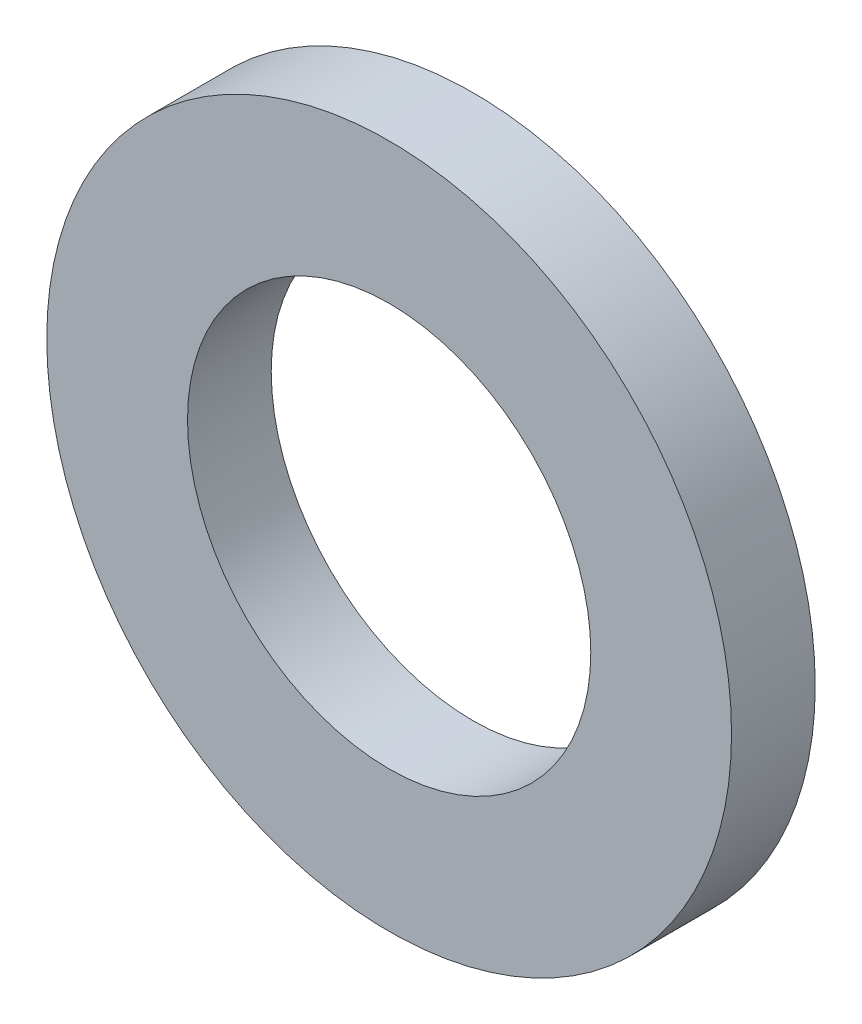
ISO-10303-21;
HEADER;
FILE_DESCRIPTION(('STEP AP214'),'2;1');
FILE_NAME('part.step','',(''),(''),'','','');
FILE_SCHEMA(('AUTOMOTIVE_DESIGN { 1 0 10303 214 1 1 1 1 }'));
ENDSEC;
DATA;
#1=APPLICATION_CONTEXT('core data for automotive mechanical design processes');
#2=APPLICATION_PROTOCOL_DEFINITION('international standard','automotive_design',2000,#1);
#3=PRODUCT_CONTEXT('',#1,'mechanical');
#4=PRODUCT('Part','Part','',(#3));
#5=PRODUCT_RELATED_PRODUCT_CATEGORY('part','',(#4));
#6=PRODUCT_DEFINITION_FORMATION('','',#4);
#7=PRODUCT_DEFINITION_CONTEXT('part definition',#1,'design');
#8=PRODUCT_DEFINITION('design','',#6,#7);
#9=PRODUCT_DEFINITION_SHAPE('','',#8);
#10=(LENGTH_UNIT() NAMED_UNIT(*) SI_UNIT(.MILLI.,.METRE.));
#11=(NAMED_UNIT(*) PLANE_ANGLE_UNIT() SI_UNIT($,.RADIAN.));
#12=(NAMED_UNIT(*) SI_UNIT($,.STERADIAN.) SOLID_ANGLE_UNIT());
#13=UNCERTAINTY_MEASURE_WITH_UNIT(LENGTH_MEASURE(1.E-05),#10,'distance_accuracy_value','');
#14=(GEOMETRIC_REPRESENTATION_CONTEXT(3) GLOBAL_UNCERTAINTY_ASSIGNED_CONTEXT((#13)) GLOBAL_UNIT_ASSIGNED_CONTEXT((#10,
#11,#12)) REPRESENTATION_CONTEXT('',''));
#15=CARTESIAN_POINT('',(0.,0.,0.));
#16=DIRECTION('',(0.,0.,1.));
#17=DIRECTION('',(1.,0.,0.));
#18=AXIS2_PLACEMENT_3D('',#15,#16,#17);
#19=CARTESIAN_POINT('',(0.,0.,1.09999999999999));
#20=DIRECTION('',(0.,0.,1.));
#21=DIRECTION('',(1.,0.,0.));
#22=AXIS2_PLACEMENT_3D('',#19,#20,#21);
#23=PLANE('',#22);
#24=CARTESIAN_POINT('',(0.,0.,1.09999999999999));
#25=DIRECTION('',(0.,0.,1.));
#26=DIRECTION('',(1.,0.,0.));
#27=AXIS2_PLACEMENT_3D('',#24,#25,#26);
#28=CIRCLE('',#27,4.5);
#29=CARTESIAN_POINT('',(4.5,0.,1.09999999999999));
#30=VERTEX_POINT('',#29);
#31=EDGE_CURVE('E10',#30,#30,#28,.T.);
#32=ORIENTED_EDGE('',*,*,#31,.T.);
#33=EDGE_LOOP('',(#32));
#34=FACE_BOUND('',#33,.T.);
#35=CARTESIAN_POINT('',(0.,0.,1.09999999999999));
#36=DIRECTION('',(0.,0.,1.));
#37=DIRECTION('',(1.,0.,0.));
#38=AXIS2_PLACEMENT_3D('',#35,#36,#37);
#39=CIRCLE('',#38,2.65);
#40=CARTESIAN_POINT('',(2.65,0.,1.09999999999999));
#41=VERTEX_POINT('',#40);
#42=EDGE_CURVE('E41',#41,#41,#39,.T.);
#43=ORIENTED_EDGE('',*,*,#42,.F.);
#44=EDGE_LOOP('',(#43));
#45=FACE_BOUND('',#44,.T.);
#46=ADVANCED_FACE('F30',(#34,#45),#23,.T.);
#47=CARTESIAN_POINT('',(0.,0.,0.));
#48=DIRECTION('',(0.,0.,1.));
#49=DIRECTION('',(1.,0.,0.));
#50=AXIS2_PLACEMENT_3D('',#47,#48,#49);
#51=PLANE('',#50);
#52=CARTESIAN_POINT('',(0.,0.,0.));
#53=DIRECTION('',(0.,0.,1.));
#54=DIRECTION('',(1.,0.,0.));
#55=AXIS2_PLACEMENT_3D('',#52,#53,#54);
#56=CIRCLE('',#55,4.5);
#57=CARTESIAN_POINT('',(4.5,0.,0.));
#58=VERTEX_POINT('',#57);
#59=EDGE_CURVE('E34',#58,#58,#56,.T.);
#60=ORIENTED_EDGE('',*,*,#59,.F.);
#61=EDGE_LOOP('',(#60));
#62=FACE_BOUND('',#61,.T.);
#63=CARTESIAN_POINT('',(0.,0.,0.));
#64=DIRECTION('',(0.,0.,1.));
#65=DIRECTION('',(1.,0.,0.));
#66=AXIS2_PLACEMENT_3D('',#63,#64,#65);
#67=CIRCLE('',#66,2.65);
#68=CARTESIAN_POINT('',(2.65,0.,0.));
#69=VERTEX_POINT('',#68);
#70=EDGE_CURVE('E43',#69,#69,#67,.T.);
#71=ORIENTED_EDGE('',*,*,#70,.T.);
#72=EDGE_LOOP('',(#71));
#73=FACE_BOUND('',#72,.T.);
#74=ADVANCED_FACE('F53',(#62,#73),#51,.F.);
#75=CARTESIAN_POINT('',(0.,0.,1.09999999999999));
#76=DIRECTION('',(0.,0.,-1.));
#77=DIRECTION('',(-1.,0.,0.));
#78=AXIS2_PLACEMENT_3D('',#75,#76,#77);
#79=CYLINDRICAL_SURFACE('',#78,4.5);
#80=ORIENTED_EDGE('',*,*,#31,.F.);
#81=EDGE_LOOP('',(#80));
#82=FACE_BOUND('',#81,.T.);
#83=ORIENTED_EDGE('',*,*,#59,.T.);
#84=EDGE_LOOP('',(#83));
#85=FACE_BOUND('',#84,.T.);
#86=ADVANCED_FACE('F32',(#82,#85),#79,.T.);
#87=CARTESIAN_POINT('',(0.,0.,1.09999999999999));
#88=DIRECTION('',(0.,0.,-1.));
#89=DIRECTION('',(-1.,0.,0.));
#90=AXIS2_PLACEMENT_3D('',#87,#88,#89);
#91=CYLINDRICAL_SURFACE('',#90,2.65);
#92=ORIENTED_EDGE('',*,*,#42,.T.);
#93=EDGE_LOOP('',(#92));
#94=FACE_BOUND('',#93,.T.);
#95=ORIENTED_EDGE('',*,*,#70,.F.);
#96=EDGE_LOOP('',(#95));
#97=FACE_BOUND('',#96,.T.);
#98=ADVANCED_FACE('F49',(#94,#97),#91,.F.);
#99=CLOSED_SHELL('',(#46,#74,#86,#98));
#100=MANIFOLD_SOLID_BREP('B2',#99);
#101=ADVANCED_BREP_SHAPE_REPRESENTATION('',(#18,#100),#14);
#102=SHAPE_DEFINITION_REPRESENTATION(#9,#101);
ENDSEC;
END-ISO-10303-21;
